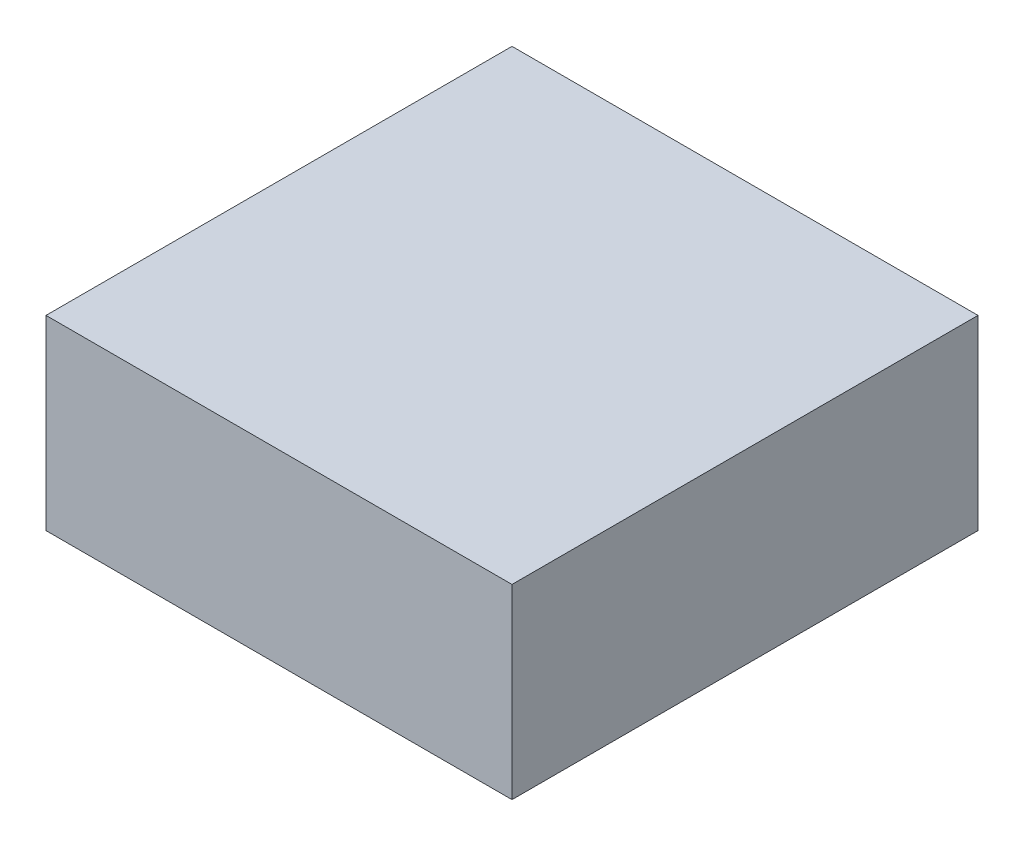
ISO-10303-21;
HEADER;
FILE_DESCRIPTION(('STEP AP214'),'2;1');
FILE_NAME('part.step','',(''),(''),'','','');
FILE_SCHEMA(('AUTOMOTIVE_DESIGN { 1 0 10303 214 1 1 1 1 }'));
ENDSEC;
DATA;
#1=APPLICATION_CONTEXT('core data for automotive mechanical design processes');
#2=APPLICATION_PROTOCOL_DEFINITION('international standard','automotive_design',2000,#1);
#3=PRODUCT_CONTEXT('',#1,'mechanical');
#4=PRODUCT('Part','Part','',(#3));
#5=PRODUCT_RELATED_PRODUCT_CATEGORY('part','',(#4));
#6=PRODUCT_DEFINITION_FORMATION('','',#4);
#7=PRODUCT_DEFINITION_CONTEXT('part definition',#1,'design');
#8=PRODUCT_DEFINITION('design','',#6,#7);
#9=PRODUCT_DEFINITION_SHAPE('','',#8);
#10=(LENGTH_UNIT() NAMED_UNIT(*) SI_UNIT(.MILLI.,.METRE.));
#11=(NAMED_UNIT(*) PLANE_ANGLE_UNIT() SI_UNIT($,.RADIAN.));
#12=(NAMED_UNIT(*) SI_UNIT($,.STERADIAN.) SOLID_ANGLE_UNIT());
#13=UNCERTAINTY_MEASURE_WITH_UNIT(LENGTH_MEASURE(1.E-05),#10,'distance_accuracy_value','');
#14=(GEOMETRIC_REPRESENTATION_CONTEXT(3) GLOBAL_UNCERTAINTY_ASSIGNED_CONTEXT((#13)) GLOBAL_UNIT_ASSIGNED_CONTEXT((#10,
#11,#12)) REPRESENTATION_CONTEXT('',''));
#15=CARTESIAN_POINT('',(0.,0.,0.));
#16=DIRECTION('',(0.,0.,1.));
#17=DIRECTION('',(1.,0.,0.));
#18=AXIS2_PLACEMENT_3D('',#15,#16,#17);
#19=CARTESIAN_POINT('',(75.,60.,75.));
#20=DIRECTION('',(-1.,0.,0.));
#21=DIRECTION('',(0.,0.,1.));
#22=AXIS2_PLACEMENT_3D('',#19,#20,#21);
#23=PLANE('',#22);
#24=DIRECTION('',(0.,0.,-1.));
#25=VECTOR('',#24,1.);
#26=CARTESIAN_POINT('',(75.,0.,75.));
#27=LINE('',#26,#25);
#28=CARTESIAN_POINT('',(75.,0.,75.));
#29=VERTEX_POINT('',#28);
#30=CARTESIAN_POINT('',(75.,0.,-75.));
#31=VERTEX_POINT('',#30);
#32=EDGE_CURVE('E105',#29,#31,#27,.T.);
#33=ORIENTED_EDGE('',*,*,#32,.T.);
#34=DIRECTION('',(0.,-1.,0.));
#35=VECTOR('',#34,1.);
#36=CARTESIAN_POINT('',(75.,60.,-75.));
#37=LINE('',#36,#35);
#38=CARTESIAN_POINT('',(75.,60.,-75.));
#39=VERTEX_POINT('',#38);
#40=EDGE_CURVE('E11',#39,#31,#37,.T.);
#41=ORIENTED_EDGE('',*,*,#40,.F.);
#42=DIRECTION('',(0.,0.,-1.));
#43=VECTOR('',#42,1.);
#44=CARTESIAN_POINT('',(75.,60.,75.));
#45=LINE('',#44,#43);
#46=CARTESIAN_POINT('',(75.,60.,75.));
#47=VERTEX_POINT('',#46);
#48=EDGE_CURVE('E89',#47,#39,#45,.T.);
#49=ORIENTED_EDGE('',*,*,#48,.F.);
#50=DIRECTION('',(0.,-1.,0.));
#51=VECTOR('',#50,1.);
#52=CARTESIAN_POINT('',(75.,60.,75.));
#53=LINE('',#52,#51);
#54=EDGE_CURVE('E97',#47,#29,#53,.T.);
#55=ORIENTED_EDGE('',*,*,#54,.T.);
#56=EDGE_LOOP('',(#33,#41,#49,#55));
#57=FACE_BOUND('',#56,.T.);
#58=ADVANCED_FACE('F39',(#57),#23,.F.);
#59=CARTESIAN_POINT('',(-75.,60.,-75.));
#60=DIRECTION('',(0.,0.,1.));
#61=DIRECTION('',(1.,0.,0.));
#62=AXIS2_PLACEMENT_3D('',#59,#60,#61);
#63=PLANE('',#62);
#64=DIRECTION('',(-1.,0.,0.));
#65=VECTOR('',#64,1.);
#66=CARTESIAN_POINT('',(-75.,0.,-75.));
#67=LINE('',#66,#65);
#68=CARTESIAN_POINT('',(-75.,0.,-75.));
#69=VERTEX_POINT('',#68);
#70=EDGE_CURVE('E92',#31,#69,#67,.T.);
#71=ORIENTED_EDGE('',*,*,#70,.T.);
#72=DIRECTION('',(0.,-1.,0.));
#73=VECTOR('',#72,1.);
#74=CARTESIAN_POINT('',(-75.,60.,-75.));
#75=LINE('',#74,#73);
#76=CARTESIAN_POINT('',(-75.,60.,-75.));
#77=VERTEX_POINT('',#76);
#78=EDGE_CURVE('E50',#77,#69,#75,.T.);
#79=ORIENTED_EDGE('',*,*,#78,.F.);
#80=DIRECTION('',(-1.,0.,0.));
#81=VECTOR('',#80,1.);
#82=CARTESIAN_POINT('',(-75.,60.,-75.));
#83=LINE('',#82,#81);
#84=EDGE_CURVE('E82',#39,#77,#83,.T.);
#85=ORIENTED_EDGE('',*,*,#84,.F.);
#86=ORIENTED_EDGE('',*,*,#40,.T.);
#87=EDGE_LOOP('',(#71,#79,#85,#86));
#88=FACE_BOUND('',#87,.T.);
#89=ADVANCED_FACE('F93',(#88),#63,.F.);
#90=CARTESIAN_POINT('',(-75.,60.,75.));
#91=DIRECTION('',(1.,0.,0.));
#92=DIRECTION('',(0.,0.,-1.));
#93=AXIS2_PLACEMENT_3D('',#90,#91,#92);
#94=PLANE('',#93);
#95=DIRECTION('',(0.,0.,1.));
#96=VECTOR('',#95,1.);
#97=CARTESIAN_POINT('',(-75.,0.,75.));
#98=LINE('',#97,#96);
#99=CARTESIAN_POINT('',(-75.,0.,75.));
#100=VERTEX_POINT('',#99);
#101=EDGE_CURVE('E72',#69,#100,#98,.T.);
#102=ORIENTED_EDGE('',*,*,#101,.T.);
#103=DIRECTION('',(0.,-1.,0.));
#104=VECTOR('',#103,1.);
#105=CARTESIAN_POINT('',(-75.,60.,75.));
#106=LINE('',#105,#104);
#107=CARTESIAN_POINT('',(-75.,60.,75.));
#108=VERTEX_POINT('',#107);
#109=EDGE_CURVE('E94',#108,#100,#106,.T.);
#110=ORIENTED_EDGE('',*,*,#109,.F.);
#111=DIRECTION('',(0.,0.,1.));
#112=VECTOR('',#111,1.);
#113=CARTESIAN_POINT('',(-75.,60.,75.));
#114=LINE('',#113,#112);
#115=EDGE_CURVE('E88',#77,#108,#114,.T.);
#116=ORIENTED_EDGE('',*,*,#115,.F.);
#117=ORIENTED_EDGE('',*,*,#78,.T.);
#118=EDGE_LOOP('',(#102,#110,#116,#117));
#119=FACE_BOUND('',#118,.T.);
#120=ADVANCED_FACE('F96',(#119),#94,.F.);
#121=CARTESIAN_POINT('',(-75.,60.,75.));
#122=DIRECTION('',(0.,0.,-1.));
#123=DIRECTION('',(-1.,0.,0.));
#124=AXIS2_PLACEMENT_3D('',#121,#122,#123);
#125=PLANE('',#124);
#126=DIRECTION('',(1.,0.,0.));
#127=VECTOR('',#126,1.);
#128=CARTESIAN_POINT('',(-75.,0.,75.));
#129=LINE('',#128,#127);
#130=EDGE_CURVE('E76',#100,#29,#129,.T.);
#131=ORIENTED_EDGE('',*,*,#130,.T.);
#132=ORIENTED_EDGE('',*,*,#54,.F.);
#133=DIRECTION('',(1.,0.,0.));
#134=VECTOR('',#133,1.);
#135=CARTESIAN_POINT('',(-75.,60.,75.));
#136=LINE('',#135,#134);
#137=EDGE_CURVE('E54',#108,#47,#136,.T.);
#138=ORIENTED_EDGE('',*,*,#137,.F.);
#139=ORIENTED_EDGE('',*,*,#109,.T.);
#140=EDGE_LOOP('',(#131,#132,#138,#139));
#141=FACE_BOUND('',#140,.T.);
#142=ADVANCED_FACE('F108',(#141),#125,.F.);
#143=CARTESIAN_POINT('',(0.,60.,0.));
#144=DIRECTION('',(0.,-1.,0.));
#145=DIRECTION('',(0.,0.,-1.));
#146=AXIS2_PLACEMENT_3D('',#143,#144,#145);
#147=PLANE('',#146);
#148=ORIENTED_EDGE('',*,*,#48,.T.);
#149=ORIENTED_EDGE('',*,*,#84,.T.);
#150=ORIENTED_EDGE('',*,*,#115,.T.);
#151=ORIENTED_EDGE('',*,*,#137,.T.);
#152=EDGE_LOOP('',(#148,#149,#150,#151));
#153=FACE_BOUND('',#152,.T.);
#154=ADVANCED_FACE('F86',(#153),#147,.F.);
#155=CARTESIAN_POINT('',(0.,0.,0.));
#156=DIRECTION('',(0.,-1.,0.));
#157=DIRECTION('',(0.,0.,-1.));
#158=AXIS2_PLACEMENT_3D('',#155,#156,#157);
#159=PLANE('',#158);
#160=ORIENTED_EDGE('',*,*,#32,.F.);
#161=ORIENTED_EDGE('',*,*,#130,.F.);
#162=ORIENTED_EDGE('',*,*,#101,.F.);
#163=ORIENTED_EDGE('',*,*,#70,.F.);
#164=EDGE_LOOP('',(#160,#161,#162,#163));
#165=FACE_BOUND('',#164,.T.);
#166=ADVANCED_FACE('F115',(#165),#159,.T.);
#167=CLOSED_SHELL('',(#58,#89,#120,#142,#154,#166));
#168=MANIFOLD_SOLID_BREP('B2',#167);
#169=ADVANCED_BREP_SHAPE_REPRESENTATION('',(#18,#168),#14);
#170=SHAPE_DEFINITION_REPRESENTATION(#9,#169);
ENDSEC;
END-ISO-10303-21;
